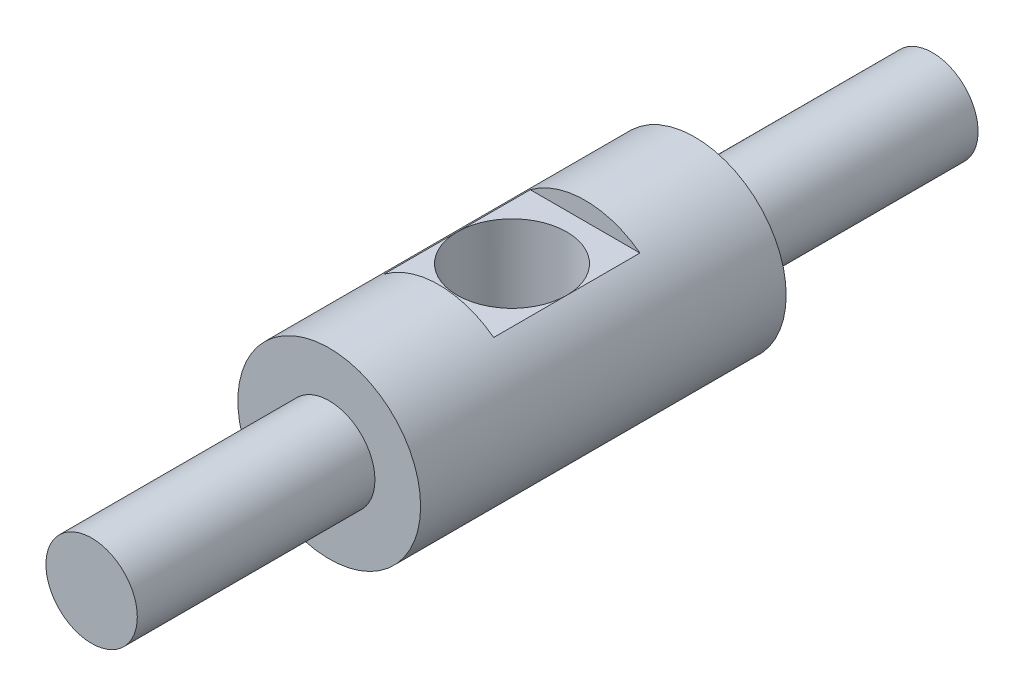
ISO-10303-21;
HEADER;
FILE_DESCRIPTION(('STEP AP214'),'2;1');
FILE_NAME('part.step','',(''),(''),'','','');
FILE_SCHEMA(('AUTOMOTIVE_DESIGN { 1 0 10303 214 1 1 1 1 }'));
ENDSEC;
DATA;
#1=APPLICATION_CONTEXT('core data for automotive mechanical design processes');
#2=APPLICATION_PROTOCOL_DEFINITION('international standard','automotive_design',2000,#1);
#3=PRODUCT_CONTEXT('',#1,'mechanical');
#4=PRODUCT('Part','Part','',(#3));
#5=PRODUCT_RELATED_PRODUCT_CATEGORY('part','',(#4));
#6=PRODUCT_DEFINITION_FORMATION('','',#4);
#7=PRODUCT_DEFINITION_CONTEXT('part definition',#1,'design');
#8=PRODUCT_DEFINITION('design','',#6,#7);
#9=PRODUCT_DEFINITION_SHAPE('','',#8);
#10=(LENGTH_UNIT() NAMED_UNIT(*) SI_UNIT(.MILLI.,.METRE.));
#11=(NAMED_UNIT(*) PLANE_ANGLE_UNIT() SI_UNIT($,.RADIAN.));
#12=(NAMED_UNIT(*) SI_UNIT($,.STERADIAN.) SOLID_ANGLE_UNIT());
#13=UNCERTAINTY_MEASURE_WITH_UNIT(LENGTH_MEASURE(1.E-05),#10,'distance_accuracy_value','');
#14=(GEOMETRIC_REPRESENTATION_CONTEXT(3) GLOBAL_UNCERTAINTY_ASSIGNED_CONTEXT((#13)) GLOBAL_UNIT_ASSIGNED_CONTEXT((#10,
#11,#12)) REPRESENTATION_CONTEXT('',''));
#15=CARTESIAN_POINT('',(0.,0.,0.));
#16=DIRECTION('',(0.,0.,1.));
#17=DIRECTION('',(1.,0.,0.));
#18=AXIS2_PLACEMENT_3D('',#15,#16,#17);
#19=CARTESIAN_POINT('',(0.,0.,100.));
#20=DIRECTION('',(0.,0.,-1.));
#21=DIRECTION('',(-1.,0.,0.));
#22=AXIS2_PLACEMENT_3D('',#19,#20,#21);
#23=CYLINDRICAL_SURFACE('',#22,25.);
#24=CARTESIAN_POINT('',(0.,0.,100.));
#25=DIRECTION('',(0.,0.,1.));
#26=DIRECTION('',(1.,0.,0.));
#27=AXIS2_PLACEMENT_3D('',#24,#25,#26);
#28=CIRCLE('',#27,25.);
#29=CARTESIAN_POINT('',(25.,0.,100.));
#30=VERTEX_POINT('',#29);
#31=EDGE_CURVE('E136',#30,#30,#28,.T.);
#32=ORIENTED_EDGE('',*,*,#31,.F.);
#33=EDGE_LOOP('',(#32));
#34=FACE_BOUND('',#33,.T.);
#35=CARTESIAN_POINT('',(0.,0.,0.));
#36=DIRECTION('',(0.,0.,1.));
#37=DIRECTION('',(1.,0.,0.));
#38=AXIS2_PLACEMENT_3D('',#35,#36,#37);
#39=CIRCLE('',#38,25.);
#40=CARTESIAN_POINT('',(25.,0.,0.));
#41=VERTEX_POINT('',#40);
#42=EDGE_CURVE('E91',#41,#41,#39,.T.);
#43=ORIENTED_EDGE('',*,*,#42,.T.);
#44=EDGE_LOOP('',(#43));
#45=FACE_BOUND('',#44,.T.);
#46=CARTESIAN_POINT('',(0.,-25.,35.));
#47=CARTESIAN_POINT('',(0.383843598201931,-24.9999970861597,35.0000031269041));
#48=CARTESIAN_POINT('',(0.767784254040576,-24.991137438834,35.0147565531599));
#49=CARTESIAN_POINT('',(1.53276887263417,-24.9559090750233,35.0735825862566));
#50=CARTESIAN_POINT('',(1.91381100849754,-24.9295301138906,35.1176723479311));
#51=CARTESIAN_POINT('',(2.67072508911214,-24.8598465581404,35.2346965595008));
#52=CARTESIAN_POINT('',(3.0465839447191,-24.816505173134,35.3076937117443));
#53=CARTESIAN_POINT('',(3.78950828651222,-24.7139687091223,35.4815575302639));
#54=CARTESIAN_POINT('',(4.15657496199743,-24.6547757876649,35.5824204038042));
#55=CARTESIAN_POINT('',(4.87779877599095,-24.5222523283562,35.8102362279742));
#56=CARTESIAN_POINT('',(5.23201108142516,-24.4489936333394,35.9370568046996));
#57=CARTESIAN_POINT('',(5.92746529298513,-24.2897598083599,36.215751468839));
#58=CARTESIAN_POINT('',(6.2687068053396,-24.2037842927231,36.367626316112));
#59=CARTESIAN_POINT('',(6.93642888935362,-24.0209437141629,36.6949574881623));
#60=CARTESIAN_POINT('',(7.2629157388265,-23.9240833448709,36.870403655141));
#61=CARTESIAN_POINT('',(7.89998904730599,-23.7213395040689,37.2435708010772));
#62=CARTESIAN_POINT('',(8.21057359815958,-23.6154549537696,37.441294444092));
#63=CARTESIAN_POINT('',(8.83781905465296,-23.3882992480134,37.8736271873829));
#64=CARTESIAN_POINT('',(9.1531312214518,-23.2664706017758,38.1099002481663));
#65=CARTESIAN_POINT('',(9.76292137525629,-23.0172517437796,38.6052773526641));
#66=CARTESIAN_POINT('',(10.057398454286,-22.8898612900329,38.8643823902735));
#67=CARTESIAN_POINT('',(10.6248831675776,-22.6320370342775,39.4044596299302));
#68=CARTESIAN_POINT('',(10.8978641157463,-22.5015997022108,39.6854581769681));
#69=CARTESIAN_POINT('',(11.4210121902915,-22.2406371712,40.2679021934876));
#70=CARTESIAN_POINT('',(11.671178827851,-22.1101119704335,40.569348100831));
#71=CARTESIAN_POINT('',(12.1769914408693,-21.8360582425371,41.2299076910985));
#72=CARTESIAN_POINT('',(12.4295387034086,-21.6929009005901,41.5915574831778));
#73=CARTESIAN_POINT('',(12.9030726391603,-21.4146251545039,42.3380099598432));
#74=CARTESIAN_POINT('',(13.1240540998314,-21.279508080219,42.7228164534776));
#75=CARTESIAN_POINT('',(13.5322641506391,-21.0222731752269,43.5134377740447));
#76=CARTESIAN_POINT('',(13.7195368165732,-20.9001384563758,43.9192242612068));
#77=CARTESIAN_POINT('',(14.0584554713944,-20.6736891809441,44.7501471343738));
#78=CARTESIAN_POINT('',(14.2101147555573,-20.5693679781584,45.1752762283664));
#79=CARTESIAN_POINT('',(14.443430354607,-20.4059403493866,45.9373000639416));
#80=CARTESIAN_POINT('',(14.5331472679521,-20.3419988147078,46.2707086302753));
#81=CARTESIAN_POINT('',(14.6897511158531,-20.2292004538863,46.945324235467));
#82=CARTESIAN_POINT('',(14.7566431317938,-20.1803402704946,47.2865295205123));
#83=CARTESIAN_POINT('',(14.8666742572357,-20.0994197441264,47.9743706695164));
#84=CARTESIAN_POINT('',(14.9098377634727,-20.0673421475889,48.3210005774207));
#85=CARTESIAN_POINT('',(14.9718816218246,-20.0210956696035,49.0176376324372));
#86=CARTESIAN_POINT('',(14.9907615559489,-20.0069270964218,49.3676448375779));
#87=CARTESIAN_POINT('',(15.0039499265836,-19.9970387456714,50.0690758823756));
#88=CARTESIAN_POINT('',(14.9982099161591,-20.0013553430504,50.42050115441));
#89=CARTESIAN_POINT('',(14.9621411232559,-20.0283506968187,51.1213696557281));
#90=CARTESIAN_POINT('',(14.9318122213057,-20.0510295424255,51.4708128753733));
#91=CARTESIAN_POINT('',(14.8470086291074,-20.1139032813397,52.1653704023207));
#92=CARTESIAN_POINT('',(14.7925183964389,-20.1541094492836,52.5104817758635));
#93=CARTESIAN_POINT('',(14.6601590013996,-20.2505906994963,53.1938844553663));
#94=CARTESIAN_POINT('',(14.5822892988101,-20.3068661530693,53.5321756035418));
#95=CARTESIAN_POINT('',(14.4053154515478,-20.4327800596766,54.1956178242335));
#96=CARTESIAN_POINT('',(14.3065063553846,-20.5022315596226,54.5208836153031));
#97=CARTESIAN_POINT('',(14.0880247918821,-20.6529698240816,55.1616057830439));
#98=CARTESIAN_POINT('',(13.9683455042383,-20.7342604561453,55.4770589131374));
#99=CARTESIAN_POINT('',(13.7091228330125,-20.9065578167818,56.0969527700244));
#100=CARTESIAN_POINT('',(13.5695782545621,-20.9975651297165,56.4013928330154));
#101=CARTESIAN_POINT('',(13.2715474690814,-21.1871947948246,56.9983821609706));
#102=CARTESIAN_POINT('',(13.1130602851057,-21.285817539663,57.2909308116039));
#103=CARTESIAN_POINT('',(12.7486253866408,-21.5064058540751,57.9135614292792));
#104=CARTESIAN_POINT('',(12.5392260080174,-21.6294357356237,58.2412503305741));
#105=CARTESIAN_POINT('',(12.0966278114806,-21.8800426177679,58.8781745015337));
#106=CARTESIAN_POINT('',(11.8634327560062,-22.0076188974429,59.1874126763083));
#107=CARTESIAN_POINT('',(11.3739770929309,-22.264525658336,59.7868536766887));
#108=CARTESIAN_POINT('',(11.1176939142337,-22.3938577488344,60.0770373848497));
#109=CARTESIAN_POINT('',(10.5831847951293,-22.6513624553685,60.63701251475));
#110=CARTESIAN_POINT('',(10.3049576243925,-22.7795350059429,60.9068027914317));
#111=CARTESIAN_POINT('',(9.68713352998387,-23.0496938210152,61.4610137545275));
#112=CARTESIAN_POINT('',(9.34439126214339,-23.1911109861692,61.7422201062111));
#113=CARTESIAN_POINT('',(8.63303424111083,-23.4652087602107,62.2746941892354));
#114=CARTESIAN_POINT('',(8.2644167615809,-23.5978884456117,62.5259587582178));
#115=CARTESIAN_POINT('',(7.50325185662638,-23.8508273067756,62.9962007589419));
#116=CARTESIAN_POINT('',(7.11071324127699,-23.9710910118614,63.215189977217));
#117=CARTESIAN_POINT('',(6.30389449388674,-24.195788680839,63.6185257425466));
#118=CARTESIAN_POINT('',(5.88961706850805,-24.3002246091541,63.802876589335));
#119=CARTESIAN_POINT('',(5.06893197868009,-24.4841063656874,64.1240105176768));
#120=CARTESIAN_POINT('',(4.66367129451915,-24.564711665597,64.2630578603281));
#121=CARTESIAN_POINT('',(3.83961804513013,-24.7069238908804,64.5066148943174));
#122=CARTESIAN_POINT('',(3.42082586865653,-24.7685313615191,64.6111255769132));
#123=CARTESIAN_POINT('',(2.573734229538,-24.8708204616488,64.7838612307341));
#124=CARTESIAN_POINT('',(2.14544468851985,-24.9115229464216,64.8521223676352));
#125=CARTESIAN_POINT('',(1.28306575999735,-24.9707917165063,64.951322334706));
#126=CARTESIAN_POINT('',(0.848977196916334,-24.9893611152255,64.9822664141827));
#127=CARTESIAN_POINT('',(0.038557159901998,-25.0027956625433,65.0046599603577));
#128=CARTESIAN_POINT('',(-0.337604459154142,-25.0005398661068,65.0009062476994));
#129=CARTESIAN_POINT('',(-1.08807434287321,-24.9791304005495,64.9651986036423));
#130=CARTESIAN_POINT('',(-1.46238280559599,-24.9599785782216,64.933247754286));
#131=CARTESIAN_POINT('',(-2.20633983442916,-24.9052445158509,64.8415817868299));
#132=CARTESIAN_POINT('',(-2.57598854049865,-24.8696627705063,64.781867504675));
#133=CARTESIAN_POINT('',(-3.30803230029226,-24.7829131822675,64.635445403638));
#134=CARTESIAN_POINT('',(-3.67042717367751,-24.7317449523865,64.5487369145329));
#135=CARTESIAN_POINT('',(-4.37685523301615,-24.616419378412,64.3518050721528));
#136=CARTESIAN_POINT('',(-4.72112071492132,-24.5526100445156,64.2422082013575));
#137=CARTESIAN_POINT('',(-5.39860860100539,-24.4125926873419,63.9994468240124));
#138=CARTESIAN_POINT('',(-5.73183134124647,-24.3363850417986,63.8662830354547));
#139=CARTESIAN_POINT('',(-6.38567322040938,-24.1730581959947,63.5775884701374));
#140=CARTESIAN_POINT('',(-6.7062916418051,-24.0859383757151,63.4220564223609));
#141=CARTESIAN_POINT('',(-7.3336251764025,-23.9024012053276,63.0898415810671));
#142=CARTESIAN_POINT('',(-7.64033861236355,-23.8059827379661,62.9131562453168));
#143=CARTESIAN_POINT('',(-8.26980517998059,-23.5951606294873,62.5204565917284));
#144=CARTESIAN_POINT('',(-8.59092272944407,-23.4799288054403,62.302263844095));
#145=CARTESIAN_POINT('',(-9.21369198185214,-23.2426106694796,61.8430399433045));
#146=CARTESIAN_POINT('',(-9.51534255354477,-23.1205239599888,61.6020074649058));
#147=CARTESIAN_POINT('',(-10.0984876356475,-22.8718413348671,61.0981613776186));
#148=CARTESIAN_POINT('',(-10.3799603037873,-22.7452407484749,60.8353248105221));
#149=CARTESIAN_POINT('',(-10.9214919932809,-22.490233495056,60.2892611034696));
#150=CARTESIAN_POINT('',(-11.1815501111138,-22.3618267520915,60.0060331041038));
#151=CARTESIAN_POINT('',(-11.711842411274,-22.0892014122374,59.3819810446192));
#152=CARTESIAN_POINT('',(-11.9789793522584,-21.9451050516921,59.0384631139215));
#153=CARTESIAN_POINT('',(-12.4833594208291,-21.6621647753414,58.327998291782));
#154=CARTESIAN_POINT('',(-12.7205977369527,-21.523321707436,57.9610476436887));
#155=CARTESIAN_POINT('',(-13.1633137600036,-21.2554478593413,57.2054656587414));
#156=CARTESIAN_POINT('',(-13.3688175501278,-21.1264090656337,56.8168524881679));
#157=CARTESIAN_POINT('',(-13.7463221620137,-20.8827470598031,56.0193930089773));
#158=CARTESIAN_POINT('',(-13.9183331635794,-20.7681194713009,55.6105528956687));
#159=CARTESIAN_POINT('',(-14.1933907541535,-20.5807934083521,54.8651432768792));
#160=CARTESIAN_POINT('',(-14.3033087605131,-20.5043856706989,54.53202936641));
#161=CARTESIAN_POINT('',(-14.5001155308505,-20.3656858868337,53.8562212925166));
#162=CARTESIAN_POINT('',(-14.5870093260325,-20.3033907571952,53.5135292402122));
#163=CARTESIAN_POINT('',(-14.7366422105018,-20.1950469968589,52.8207789900045));
#164=CARTESIAN_POINT('',(-14.7994087863437,-20.1489798836817,52.4707296563381));
#165=CARTESIAN_POINT('',(-14.9000384338231,-20.0746802537378,51.7651686919006));
#166=CARTESIAN_POINT('',(-14.9379013600587,-20.0464478411006,51.4096570292497));
#167=CARTESIAN_POINT('',(-14.9882188418345,-20.0088555504116,50.6944654577172));
#168=CARTESIAN_POINT('',(-15.000575965109,-19.9995680435521,50.3347748241052));
#169=CARTESIAN_POINT('',(-14.9993827596147,-20.0004629136012,49.6154605813217));
#170=CARTESIAN_POINT('',(-14.9858323853129,-20.0106453247287,49.2558369722693));
#171=CARTESIAN_POINT('',(-14.933039960013,-20.0500720623985,48.5393778623293));
#172=CARTESIAN_POINT('',(-14.8937856905246,-20.0793254544093,48.1825437691275));
#173=CARTESIAN_POINT('',(-14.7901958992562,-20.1557492567276,47.4745036663139));
#174=CARTESIAN_POINT('',(-14.7258602739107,-20.2029197410183,47.1232976799478));
#175=CARTESIAN_POINT('',(-14.5767391025224,-20.3107531861942,46.4456865041404));
#176=CARTESIAN_POINT('',(-14.4930978422934,-20.3706500394351,46.1189049936359));
#177=CARTESIAN_POINT('',(-14.3048374038112,-20.503289403388,45.4740190830719));
#178=CARTESIAN_POINT('',(-14.2002114321044,-20.5760360731037,45.1559175309896));
#179=CARTESIAN_POINT('',(-13.9709549384207,-20.7323817775245,44.52975334267));
#180=CARTESIAN_POINT('',(-13.8463230372323,-20.8159815603686,44.2216914003275));
#181=CARTESIAN_POINT('',(-13.577991485859,-20.9919958236309,43.6166075286809));
#182=CARTESIAN_POINT('',(-13.4342910062629,-21.0844106874226,43.3195860803164));
#183=CARTESIAN_POINT('',(-13.1052044073709,-21.2907700846095,42.6926431454733));
#184=CARTESIAN_POINT('',(-12.9168055284846,-21.4058416967628,42.364671899442));
#185=CARTESIAN_POINT('',(-12.5169261183886,-21.642100118335,41.7254162679367));
#186=CARTESIAN_POINT('',(-12.3054428698542,-21.7632876467706,41.414133853396));
#187=CARTESIAN_POINT('',(-11.8602581653327,-22.0090654256467,40.8089458977728));
#188=CARTESIAN_POINT('',(-11.6265414946063,-22.1336579640345,40.5150524826424));
#189=CARTESIAN_POINT('',(-11.1379037923633,-22.3835300736241,39.9457553442247));
#190=CARTESIAN_POINT('',(-10.8829814131332,-22.5088096880192,39.6703527981245));
#191=CARTESIAN_POINT('',(-10.3093956231846,-22.7778929374613,39.0955492744482));
#192=CARTESIAN_POINT('',(-9.98712444962472,-22.9213771055024,38.7995841468522));
#193=CARTESIAN_POINT('',(-9.31630351045606,-23.2021274121993,38.2357110000058));
#194=CARTESIAN_POINT('',(-8.96775055984756,-23.3393927939842,37.9678063907438));
#195=CARTESIAN_POINT('',(-8.24572196159847,-23.6041516372397,37.4619603223413));
#196=CARTESIAN_POINT('',(-7.87223408279991,-23.7316402361083,37.2240337357929));
#197=CARTESIAN_POINT('',(-7.10241008284998,-23.9732864709495,36.7805814406347));
#198=CARTESIAN_POINT('',(-6.70607683112239,-24.0874457756816,36.5750516749784));
#199=CARTESIAN_POINT('',(-5.90535485537673,-24.2959393450001,36.2045152184251));
#200=CARTESIAN_POINT('',(-5.50158081631706,-24.3907721979159,36.0384635038685));
#201=CARTESIAN_POINT('',(-4.67750151978476,-24.5621264167291,35.741219652049));
#202=CARTESIAN_POINT('',(-4.25719351622461,-24.638644725728,35.6100333338009));
#203=CARTESIAN_POINT('',(-3.40501595177149,-24.7707728782358,35.3849576497079));
#204=CARTESIAN_POINT('',(-2.97318944063259,-24.8264513407411,35.2909458212866));
#205=CARTESIAN_POINT('',(-2.10091679412845,-24.9154168023929,35.1412770165889));
#206=CARTESIAN_POINT('',(-1.66047815319872,-24.9487224499678,35.0855880960428));
#207=CARTESIAN_POINT('',(-1.01562005124391,-24.9801864376456,35.0330415687078));
#208=CARTESIAN_POINT('',(-0.812782174910446,-24.9876101393964,35.0206575593774));
#209=CARTESIAN_POINT('',(-0.406638621564428,-24.9975177780224,35.004135803793));
#210=CARTESIAN_POINT('',(-0.203332928569455,-25.0000015435445,34.9999983435895));
#211=CARTESIAN_POINT('',(0.,-25.,35.));
#212=B_SPLINE_CURVE_WITH_KNOTS('',3,(#46,#47,#48,#49,#50,#51,#52,#53,#54,#55,#56,#57,#58,#59,
#60,#61,#62,#63,#64,#65,#66,#67,#68,#69,#70,#71,#72,#73,#74,#75,#76,#77,#78,#79,#80,#81,#82,#83,
#84,#85,#86,#87,#88,#89,#90,#91,#92,#93,#94,#95,#96,#97,#98,#99,#100,#101,#102,#103,#104,#105,
#106,#107,#108,#109,#110,#111,#112,#113,#114,#115,#116,#117,#118,#119,#120,#121,#122,#123,#124,
#125,#126,#127,#128,#129,#130,#131,#132,#133,#134,#135,#136,#137,#138,#139,#140,#141,#142,#143,
#144,#145,#146,#147,#148,#149,#150,#151,#152,#153,#154,#155,#156,#157,#158,#159,#160,#161,#162,
#163,#164,#165,#166,#167,#168,#169,#170,#171,#172,#173,#174,#175,#176,#177,#178,#179,#180,#181,
#182,#183,#184,#185,#186,#187,#188,#189,#190,#191,#192,#193,#194,#195,#196,#197,#198,#199,#200,
#201,#202,#203,#204,#205,#206,#207,#208,#209,#210,#211),.UNSPECIFIED.,.T.,.F.,(4,2,2,2,2,2,2,2,
2,2,2,2,2,2,2,2,2,2,2,2,2,2,2,2,2,2,2,2,2,2,2,2,2,2,2,2,2,2,2,2,2,2,2,2,2,2,2,2,2,2,2,2,2,2,2,2,
2,2,2,2,2,2,2,2,2,2,2,2,2,2,2,2,2,2,2,2,2,2,2,2,2,2,4),(0.,1.15131650286521,2.30330684658597,
3.45780975393181,4.612155602032,5.76075519873301,6.90938963716679,8.05753066262214,
9.20580913480962,10.4418189333315,11.677882563005,12.9154572581261,14.1530584631589,
15.5426172518037,16.9324052372309,18.3203625971641,19.7078009747203,20.7601695949573,
21.8123037789111,22.8633541662871,23.9144226450402,24.9675603560417,26.0207031840108,
27.0745244592484,28.1283700865276,29.1682513024588,30.2084729869153,31.2487572656591,
32.2890952191643,33.5115258926161,34.7337635807986,35.9572093784948,37.1807238197138,
38.5750211979187,39.9694657072174,41.3633997151926,42.757160576736,44.0631614250121,
45.3691247856981,46.6737827450107,47.9782571595934,49.1054114040664,50.2324424620235,
51.3594395877587,52.4864646972628,53.5859458393993,54.6853934903978,55.7849036392926,
56.8845460618251,58.0982352119811,59.3119948278363,60.5270490774492,61.7421545662941,
63.1157547067805,64.4895756135914,65.8622612715279,67.2345290616493,68.310502748735,
69.3862411219535,70.4607503192203,71.5352657900453,72.6138783741587,73.6924928539612,
74.7716204317745,75.8507524655586,76.8775008650292,77.9045821954033,78.9317343633339,
79.9589312231551,81.143836327243,82.3288810604908,83.5147426565243,84.7006796768089,
86.080471860688,87.4604315264943,88.8410731397027,90.221541717883,91.5598929838274,
92.8984674797595,94.2325948699265,95.5656088394694,96.1754729545425,96.785358223789),.UNSPECIFIED.);
#213=CARTESIAN_POINT('',(0.,-25.,35.));
#214=VERTEX_POINT('',#213);
#215=EDGE_CURVE('E69',#214,#214,#212,.T.);
#216=ORIENTED_EDGE('',*,*,#215,.F.);
#217=EDGE_LOOP('',(#216));
#218=FACE_BOUND('',#217,.T.);
#219=CARTESIAN_POINT('',(0.,0.,70.));
#220=DIRECTION('',(0.,0.,-1.));
#221=DIRECTION('',(-1.,0.,0.));
#222=AXIS2_PLACEMENT_3D('',#219,#220,#221);
#223=CIRCLE('',#222,25.);
#224=CARTESIAN_POINT('',(-15.,20.,70.));
#225=VERTEX_POINT('',#224);
#226=CARTESIAN_POINT('',(15.,20.,70.));
#227=VERTEX_POINT('',#226);
#228=EDGE_CURVE('E41',#225,#227,#223,.T.);
#229=ORIENTED_EDGE('',*,*,#228,.F.);
#230=DIRECTION('',(0.,0.,-1.));
#231=VECTOR('',#230,1.);
#232=CARTESIAN_POINT('',(-15.,20.,100.));
#233=LINE('',#232,#231);
#234=CARTESIAN_POINT('',(-15.,20.,50.));
#235=VERTEX_POINT('',#234);
#236=EDGE_CURVE('E64',#225,#235,#233,.T.);
#237=ORIENTED_EDGE('',*,*,#236,.T.);
#238=CARTESIAN_POINT('',(-15.,20.,30.));
#239=VERTEX_POINT('',#238);
#240=EDGE_CURVE('E72',#235,#239,#233,.T.);
#241=ORIENTED_EDGE('',*,*,#240,.T.);
#242=CARTESIAN_POINT('',(0.,0.,30.));
#243=DIRECTION('',(0.,0.,1.));
#244=DIRECTION('',(1.,0.,0.));
#245=AXIS2_PLACEMENT_3D('',#242,#243,#244);
#246=CIRCLE('',#245,25.);
#247=CARTESIAN_POINT('',(15.,20.,30.));
#248=VERTEX_POINT('',#247);
#249=EDGE_CURVE('E11',#248,#239,#246,.T.);
#250=ORIENTED_EDGE('',*,*,#249,.F.);
#251=DIRECTION('',(0.,0.,-1.));
#252=VECTOR('',#251,1.);
#253=CARTESIAN_POINT('',(15.,20.,100.));
#254=LINE('',#253,#252);
#255=CARTESIAN_POINT('',(15.,20.,50.));
#256=VERTEX_POINT('',#255);
#257=EDGE_CURVE('E70',#248,#256,#254,.F.);
#258=ORIENTED_EDGE('',*,*,#257,.T.);
#259=EDGE_CURVE('E76',#256,#227,#254,.F.);
#260=ORIENTED_EDGE('',*,*,#259,.T.);
#261=EDGE_LOOP('',(#229,#237,#241,#250,#258,#260));
#262=FACE_BOUND('',#261,.T.);
#263=ADVANCED_FACE('F33',(#34,#45,#218,#262),#23,.T.);
#264=CARTESIAN_POINT('',(0.,0.,100.));
#265=DIRECTION('',(0.,0.,1.));
#266=DIRECTION('',(1.,0.,0.));
#267=AXIS2_PLACEMENT_3D('',#264,#265,#266);
#268=PLANE('',#267);
#269=CARTESIAN_POINT('',(0.,0.,100.));
#270=DIRECTION('',(0.,0.,1.));
#271=DIRECTION('',(1.,0.,0.));
#272=AXIS2_PLACEMENT_3D('',#269,#270,#271);
#273=CIRCLE('',#272,12.5);
#274=CARTESIAN_POINT('',(12.5,0.,100.));
#275=VERTEX_POINT('',#274);
#276=EDGE_CURVE('E143',#275,#275,#273,.T.);
#277=ORIENTED_EDGE('',*,*,#276,.F.);
#278=EDGE_LOOP('',(#277));
#279=FACE_BOUND('',#278,.T.);
#280=ORIENTED_EDGE('',*,*,#31,.T.);
#281=EDGE_LOOP('',(#280));
#282=FACE_BOUND('',#281,.T.);
#283=ADVANCED_FACE('F119',(#279,#282),#268,.T.);
#284=CARTESIAN_POINT('',(0.,0.,0.));
#285=DIRECTION('',(0.,0.,1.));
#286=DIRECTION('',(1.,0.,0.));
#287=AXIS2_PLACEMENT_3D('',#284,#285,#286);
#288=PLANE('',#287);
#289=CARTESIAN_POINT('',(0.,0.,0.));
#290=DIRECTION('',(0.,0.,-1.));
#291=DIRECTION('',(-1.,0.,0.));
#292=AXIS2_PLACEMENT_3D('',#289,#290,#291);
#293=CIRCLE('',#292,12.5);
#294=CARTESIAN_POINT('',(-12.5,0.,0.));
#295=VERTEX_POINT('',#294);
#296=EDGE_CURVE('E84',#295,#295,#293,.T.);
#297=ORIENTED_EDGE('',*,*,#296,.F.);
#298=EDGE_LOOP('',(#297));
#299=FACE_BOUND('',#298,.T.);
#300=ORIENTED_EDGE('',*,*,#42,.F.);
#301=EDGE_LOOP('',(#300));
#302=FACE_BOUND('',#301,.T.);
#303=ADVANCED_FACE('F117',(#299,#302),#288,.F.);
#304=CARTESIAN_POINT('',(0.,0.,165.));
#305=DIRECTION('',(0.,0.,-1.));
#306=DIRECTION('',(-1.,0.,0.));
#307=AXIS2_PLACEMENT_3D('',#304,#305,#306);
#308=CYLINDRICAL_SURFACE('',#307,12.5);
#309=CARTESIAN_POINT('',(0.,0.,165.));
#310=DIRECTION('',(0.,0.,1.));
#311=DIRECTION('',(1.,0.,0.));
#312=AXIS2_PLACEMENT_3D('',#309,#310,#311);
#313=CIRCLE('',#312,12.5);
#314=CARTESIAN_POINT('',(12.5,0.,165.));
#315=VERTEX_POINT('',#314);
#316=EDGE_CURVE('E142',#315,#315,#313,.T.);
#317=ORIENTED_EDGE('',*,*,#316,.F.);
#318=EDGE_LOOP('',(#317));
#319=FACE_BOUND('',#318,.T.);
#320=ORIENTED_EDGE('',*,*,#276,.T.);
#321=EDGE_LOOP('',(#320));
#322=FACE_BOUND('',#321,.T.);
#323=ADVANCED_FACE('F113',(#319,#322),#308,.T.);
#324=CARTESIAN_POINT('',(0.,0.,165.));
#325=DIRECTION('',(0.,0.,1.));
#326=DIRECTION('',(1.,0.,0.));
#327=AXIS2_PLACEMENT_3D('',#324,#325,#326);
#328=PLANE('',#327);
#329=ORIENTED_EDGE('',*,*,#316,.T.);
#330=EDGE_LOOP('',(#329));
#331=FACE_BOUND('',#330,.T.);
#332=ADVANCED_FACE('F109',(#331),#328,.T.);
#333=CARTESIAN_POINT('',(0.,0.,-65.));
#334=DIRECTION('',(0.,0.,1.));
#335=DIRECTION('',(1.,0.,0.));
#336=AXIS2_PLACEMENT_3D('',#333,#334,#335);
#337=CYLINDRICAL_SURFACE('',#336,12.5);
#338=CARTESIAN_POINT('',(0.,0.,-65.));
#339=DIRECTION('',(0.,0.,-1.));
#340=DIRECTION('',(-1.,0.,0.));
#341=AXIS2_PLACEMENT_3D('',#338,#339,#340);
#342=CIRCLE('',#341,12.5);
#343=CARTESIAN_POINT('',(-12.5,0.,-65.));
#344=VERTEX_POINT('',#343);
#345=EDGE_CURVE('E90',#344,#344,#342,.T.);
#346=ORIENTED_EDGE('',*,*,#345,.F.);
#347=EDGE_LOOP('',(#346));
#348=FACE_BOUND('',#347,.T.);
#349=ORIENTED_EDGE('',*,*,#296,.T.);
#350=EDGE_LOOP('',(#349));
#351=FACE_BOUND('',#350,.T.);
#352=ADVANCED_FACE('F105',(#348,#351),#337,.T.);
#353=CARTESIAN_POINT('',(0.,0.,-65.));
#354=DIRECTION('',(0.,0.,-1.));
#355=DIRECTION('',(-1.,0.,0.));
#356=AXIS2_PLACEMENT_3D('',#353,#354,#355);
#357=PLANE('',#356);
#358=ORIENTED_EDGE('',*,*,#345,.T.);
#359=EDGE_LOOP('',(#358));
#360=FACE_BOUND('',#359,.T.);
#361=ADVANCED_FACE('F99',(#360),#357,.T.);
#362=CARTESIAN_POINT('',(0.,65.,50.));
#363=DIRECTION('',(0.,-1.,0.));
#364=DIRECTION('',(0.,0.,-1.));
#365=AXIS2_PLACEMENT_3D('',#362,#363,#364);
#366=CYLINDRICAL_SURFACE('',#365,15.);
#367=CARTESIAN_POINT('',(0.,20.,50.));
#368=DIRECTION('',(0.,-1.,0.));
#369=DIRECTION('',(0.,0.,-1.));
#370=AXIS2_PLACEMENT_3D('',#367,#368,#369);
#371=CIRCLE('',#370,15.);
#372=EDGE_CURVE('E48',#256,#235,#371,.T.);
#373=ORIENTED_EDGE('',*,*,#372,.F.);
#374=EDGE_CURVE('E80',#235,#256,#371,.T.);
#375=ORIENTED_EDGE('',*,*,#374,.F.);
#376=EDGE_LOOP('',(#373,#375));
#377=FACE_BOUND('',#376,.T.);
#378=ORIENTED_EDGE('',*,*,#215,.T.);
#379=EDGE_LOOP('',(#378));
#380=FACE_BOUND('',#379,.T.);
#381=ADVANCED_FACE('F93',(#377,#380),#366,.F.);
#382=CARTESIAN_POINT('',(0.,20.,0.));
#383=DIRECTION('',(0.,-1.,0.));
#384=DIRECTION('',(0.,0.,-1.));
#385=AXIS2_PLACEMENT_3D('',#382,#383,#384);
#386=PLANE('',#385);
#387=DIRECTION('',(-1.,0.,0.));
#388=VECTOR('',#387,1.);
#389=CARTESIAN_POINT('',(-20.,20.,30.));
#390=LINE('',#389,#388);
#391=EDGE_CURVE('E77',#248,#239,#390,.T.);
#392=ORIENTED_EDGE('',*,*,#391,.T.);
#393=ORIENTED_EDGE('',*,*,#240,.F.);
#394=ORIENTED_EDGE('',*,*,#374,.T.);
#395=ORIENTED_EDGE('',*,*,#257,.F.);
#396=EDGE_LOOP('',(#392,#393,#394,#395));
#397=FACE_BOUND('',#396,.T.);
#398=ADVANCED_FACE('F98',(#397),#386,.F.);
#399=CARTESIAN_POINT('',(-20.,30.,30.));
#400=DIRECTION('',(0.,0.,1.));
#401=DIRECTION('',(1.,0.,0.));
#402=AXIS2_PLACEMENT_3D('',#399,#400,#401);
#403=PLANE('',#402);
#404=ORIENTED_EDGE('',*,*,#249,.T.);
#405=ORIENTED_EDGE('',*,*,#391,.F.);
#406=EDGE_LOOP('',(#404,#405));
#407=FACE_BOUND('',#406,.T.);
#408=ADVANCED_FACE('F101',(#407),#403,.T.);
#409=CARTESIAN_POINT('',(-20.,30.,70.));
#410=DIRECTION('',(0.,0.,-1.));
#411=DIRECTION('',(-1.,0.,0.));
#412=AXIS2_PLACEMENT_3D('',#409,#410,#411);
#413=PLANE('',#412);
#414=ORIENTED_EDGE('',*,*,#228,.T.);
#415=DIRECTION('',(1.,0.,0.));
#416=VECTOR('',#415,1.);
#417=CARTESIAN_POINT('',(-20.,20.,70.));
#418=LINE('',#417,#416);
#419=EDGE_CURVE('E53',#225,#227,#418,.T.);
#420=ORIENTED_EDGE('',*,*,#419,.F.);
#421=EDGE_LOOP('',(#414,#420));
#422=FACE_BOUND('',#421,.T.);
#423=ADVANCED_FACE('F74',(#422),#413,.T.);
#424=ORIENTED_EDGE('',*,*,#419,.T.);
#425=ORIENTED_EDGE('',*,*,#259,.F.);
#426=ORIENTED_EDGE('',*,*,#372,.T.);
#427=ORIENTED_EDGE('',*,*,#236,.F.);
#428=EDGE_LOOP('',(#424,#425,#426,#427));
#429=FACE_BOUND('',#428,.T.);
#430=ADVANCED_FACE('F65',(#429),#386,.F.);
#431=CLOSED_SHELL('',(#263,#283,#303,#323,#332,#352,#361,#381,#398,#408,#423,#430));
#432=MANIFOLD_SOLID_BREP('B2',#431);
#433=ADVANCED_BREP_SHAPE_REPRESENTATION('',(#18,#432),#14);
#434=SHAPE_DEFINITION_REPRESENTATION(#9,#433);
ENDSEC;
END-ISO-10303-21;
